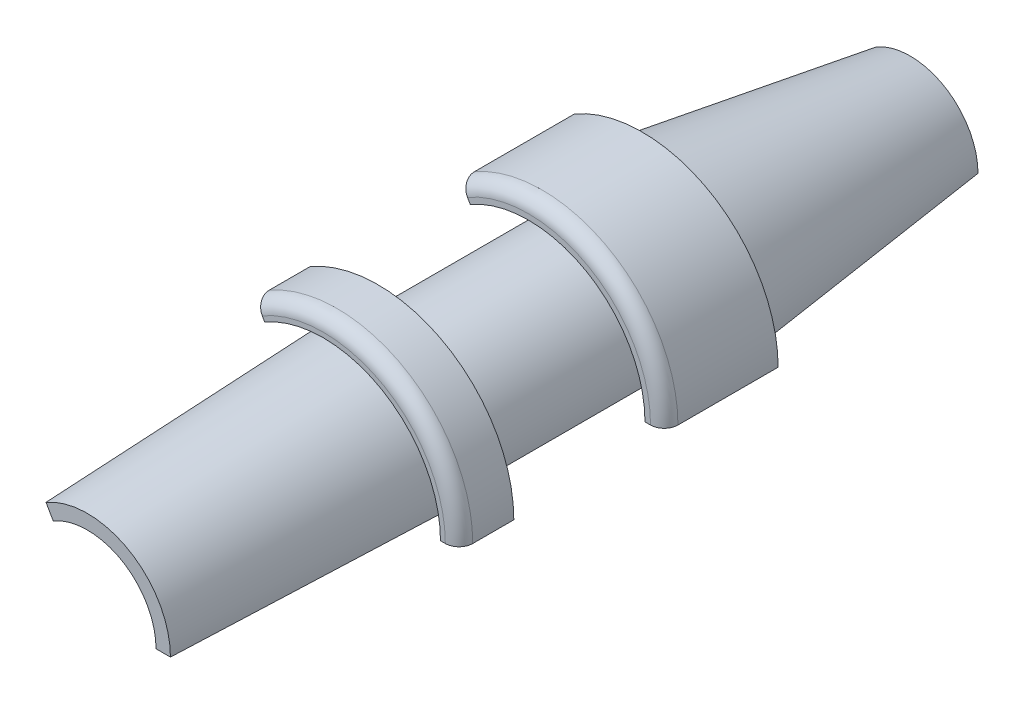
ISO-10303-21;
HEADER;
FILE_DESCRIPTION(('STEP AP214'),'2;1');
FILE_NAME('part.step','',(''),(''),'','','');
FILE_SCHEMA(('AUTOMOTIVE_DESIGN { 1 0 10303 214 1 1 1 1 }'));
ENDSEC;
DATA;
#1=APPLICATION_CONTEXT('core data for automotive mechanical design processes');
#2=APPLICATION_PROTOCOL_DEFINITION('international standard','automotive_design',2000,#1);
#3=PRODUCT_CONTEXT('',#1,'mechanical');
#4=PRODUCT('Part','Part','',(#3));
#5=PRODUCT_RELATED_PRODUCT_CATEGORY('part','',(#4));
#6=PRODUCT_DEFINITION_FORMATION('','',#4);
#7=PRODUCT_DEFINITION_CONTEXT('part definition',#1,'design');
#8=PRODUCT_DEFINITION('design','',#6,#7);
#9=PRODUCT_DEFINITION_SHAPE('','',#8);
#10=(LENGTH_UNIT() NAMED_UNIT(*) SI_UNIT(.MILLI.,.METRE.));
#11=(NAMED_UNIT(*) PLANE_ANGLE_UNIT() SI_UNIT($,.RADIAN.));
#12=(NAMED_UNIT(*) SI_UNIT($,.STERADIAN.) SOLID_ANGLE_UNIT());
#13=UNCERTAINTY_MEASURE_WITH_UNIT(LENGTH_MEASURE(1.E-05),#10,'distance_accuracy_value','');
#14=(GEOMETRIC_REPRESENTATION_CONTEXT(3) GLOBAL_UNCERTAINTY_ASSIGNED_CONTEXT((#13)) GLOBAL_UNIT_ASSIGNED_CONTEXT((#10,
#11,#12)) REPRESENTATION_CONTEXT('',''));
#15=CARTESIAN_POINT('',(0.,0.,0.));
#16=DIRECTION('',(0.,0.,1.));
#17=DIRECTION('',(1.,0.,0.));
#18=AXIS2_PLACEMENT_3D('',#15,#16,#17);
#19=CARTESIAN_POINT('',(0.,0.,0.));
#20=DIRECTION('',(0.,0.,-1.));
#21=DIRECTION('',(-1.,0.,0.));
#22=AXIS2_PLACEMENT_3D('',#19,#20,#21);
#23=CYLINDRICAL_SURFACE('',#22,2.025);
#24=CARTESIAN_POINT('',(0.,0.,28.5));
#25=DIRECTION('',(0.,0.,1.));
#26=DIRECTION('',(1.,0.,0.));
#27=AXIS2_PLACEMENT_3D('',#24,#25,#26);
#28=CIRCLE('',#27,2.025);
#29=CARTESIAN_POINT('',(-1.01250000000001,1.75370144266348,28.5));
#30=VERTEX_POINT('',#29);
#31=CARTESIAN_POINT('',(2.025,0.,28.5));
#32=VERTEX_POINT('',#31);
#33=EDGE_CURVE('E452',#30,#32,#28,.F.);
#34=ORIENTED_EDGE('',*,*,#33,.F.);
#35=DIRECTION('',(0.,0.,1.));
#36=VECTOR('',#35,1.);
#37=CARTESIAN_POINT('',(-1.01250000000001,1.75370144266348,0.));
#38=LINE('',#37,#36);
#39=CARTESIAN_POINT('',(-1.01250000000001,1.75370144266348,6.));
#40=VERTEX_POINT('',#39);
#41=EDGE_CURVE('E332',#40,#30,#38,.T.);
#42=ORIENTED_EDGE('',*,*,#41,.F.);
#43=CARTESIAN_POINT('',(0.,0.,6.));
#44=DIRECTION('',(0.,0.,-1.));
#45=DIRECTION('',(-1.,0.,0.));
#46=AXIS2_PLACEMENT_3D('',#43,#44,#45);
#47=CIRCLE('',#46,2.025);
#48=CARTESIAN_POINT('',(2.025,0.,6.));
#49=VERTEX_POINT('',#48);
#50=EDGE_CURVE('E335',#40,#49,#47,.T.);
#51=ORIENTED_EDGE('',*,*,#50,.T.);
#52=DIRECTION('',(0.,0.,1.));
#53=VECTOR('',#52,1.);
#54=CARTESIAN_POINT('',(2.025,0.,0.));
#55=LINE('',#54,#53);
#56=EDGE_CURVE('E277',#49,#32,#55,.T.);
#57=ORIENTED_EDGE('',*,*,#56,.T.);
#58=EDGE_LOOP('',(#34,#42,#51,#57));
#59=FACE_BOUND('',#58,.T.);
#60=ADVANCED_FACE('F35',(#59),#23,.F.);
#61=CARTESIAN_POINT('',(0.,0.,30.));
#62=DIRECTION('',(0.,0.,1.));
#63=DIRECTION('',(1.,0.,0.));
#64=AXIS2_PLACEMENT_3D('',#61,#62,#63);
#65=PLANE('',#64);
#66=CARTESIAN_POINT('',(0.,0.,30.));
#67=DIRECTION('',(0.,0.,1.));
#68=DIRECTION('',(1.,0.,0.));
#69=AXIS2_PLACEMENT_3D('',#66,#67,#68);
#70=CIRCLE('',#69,2.5);
#71=CARTESIAN_POINT('',(2.5,0.,30.));
#72=VERTEX_POINT('',#71);
#73=CARTESIAN_POINT('',(-1.25000000000001,2.16506350946109,30.));
#74=VERTEX_POINT('',#73);
#75=EDGE_CURVE('E199',#72,#74,#70,.T.);
#76=ORIENTED_EDGE('',*,*,#75,.F.);
#77=DIRECTION('',(-1.,0.,0.));
#78=VECTOR('',#77,1.);
#79=CARTESIAN_POINT('',(0.,0.,30.));
#80=LINE('',#79,#78);
#81=CARTESIAN_POINT('',(3.025,0.,30.));
#82=VERTEX_POINT('',#81);
#83=EDGE_CURVE('E213',#82,#72,#80,.T.);
#84=ORIENTED_EDGE('',*,*,#83,.F.);
#85=CARTESIAN_POINT('',(0.,0.,30.));
#86=DIRECTION('',(0.,0.,-1.));
#87=DIRECTION('',(-1.,0.,0.));
#88=AXIS2_PLACEMENT_3D('',#85,#86,#87);
#89=CIRCLE('',#88,3.025);
#90=CARTESIAN_POINT('',(-1.51250000000001,2.61972684644792,30.));
#91=VERTEX_POINT('',#90);
#92=EDGE_CURVE('E369',#91,#82,#89,.T.);
#93=ORIENTED_EDGE('',*,*,#92,.F.);
#94=DIRECTION('',(0.500000000000004,-0.866025403784436,0.));
#95=VECTOR('',#94,1.);
#96=CARTESIAN_POINT('',(0.,0.,30.));
#97=LINE('',#96,#95);
#98=EDGE_CURVE('E216',#91,#74,#97,.T.);
#99=ORIENTED_EDGE('',*,*,#98,.T.);
#100=EDGE_LOOP('',(#76,#84,#93,#99));
#101=FACE_BOUND('',#100,.T.);
#102=ADVANCED_FACE('F212',(#101),#65,.T.);
#103=CARTESIAN_POINT('',(0.,0.,20.));
#104=DIRECTION('',(0.,0.,-1.));
#105=DIRECTION('',(-1.,0.,0.));
#106=AXIS2_PLACEMENT_3D('',#103,#104,#105);
#107=CONICAL_SURFACE('',#106,3.44646791542901,0.0421218622610786);
#108=CARTESIAN_POINT('',(0.,0.,20.));
#109=DIRECTION('',(0.,0.,-1.));
#110=DIRECTION('',(-1.,0.,0.));
#111=AXIS2_PLACEMENT_3D('',#108,#109,#110);
#112=CIRCLE('',#111,3.44646791542901);
#113=CARTESIAN_POINT('',(-1.72323395771452,2.98472876808951,20.));
#114=VERTEX_POINT('',#113);
#115=CARTESIAN_POINT('',(3.44646791542901,0.,20.));
#116=VERTEX_POINT('',#115);
#117=EDGE_CURVE('E367',#114,#116,#112,.T.);
#118=ORIENTED_EDGE('',*,*,#117,.F.);
#119=DIRECTION('',(0.0210547037856716,-0.0364678166950954,0.999113005517389));
#120=VECTOR('',#119,1.);
#121=CARTESIAN_POINT('',(-2.14089888305084,3.70814563931148,0.180464037876745));
#122=LINE('',#121,#120);
#123=EDGE_CURVE('E281',#114,#91,#122,.T.);
#124=ORIENTED_EDGE('',*,*,#123,.T.);
#125=ORIENTED_EDGE('',*,*,#92,.T.);
#126=DIRECTION('',(-0.0421094075713426,0.,0.999113005517389));
#127=VECTOR('',#126,1.);
#128=CARTESIAN_POINT('',(4.28179776610165,0.,0.180464037876745));
#129=LINE('',#128,#127);
#130=EDGE_CURVE('E222',#116,#82,#129,.T.);
#131=ORIENTED_EDGE('',*,*,#130,.F.);
#132=EDGE_LOOP('',(#118,#124,#125,#131));
#133=FACE_BOUND('',#132,.T.);
#134=ADVANCED_FACE('F460',(#133),#107,.T.);
#135=CARTESIAN_POINT('',(0.,0.,20.253069256419));
#136=DIRECTION('',(0.,0.,1.));
#137=DIRECTION('',(1.,0.,0.));
#138=AXIS2_PLACEMENT_3D('',#135,#136,#137);
#139=CONICAL_SURFACE('',#138,4.09578672154361,1.19916094074387);
#140=CARTESIAN_POINT('',(0.,0.,20.253069256419));
#141=DIRECTION('',(0.,0.,-1.));
#142=DIRECTION('',(-1.,0.,0.));
#143=AXIS2_PLACEMENT_3D('',#140,#141,#142);
#144=CIRCLE('',#143,4.09578672154361);
#145=CARTESIAN_POINT('',(-2.04789336077182,3.54705534933974,20.253069256419));
#146=VERTEX_POINT('',#145);
#147=CARTESIAN_POINT('',(4.09578672154361,0.,20.253069256419));
#148=VERTEX_POINT('',#147);
#149=EDGE_CURVE('E365',#146,#148,#144,.T.);
#150=ORIENTED_EDGE('',*,*,#149,.F.);
#151=DIRECTION('',(0.465867359143861,-0.806905935625096,-0.363139662853443));
#152=VECTOR('',#151,1.);
#153=CARTESIAN_POINT('',(3.15625473798528,-5.46679356782044,16.196479866909));
#154=LINE('',#153,#152);
#155=EDGE_CURVE('E284',#146,#114,#154,.T.);
#156=ORIENTED_EDGE('',*,*,#155,.T.);
#157=ORIENTED_EDGE('',*,*,#117,.T.);
#158=DIRECTION('',(-0.931734718287715,0.,-0.363139662853443));
#159=VECTOR('',#158,1.);
#160=CARTESIAN_POINT('',(-6.31250947597051,0.,16.196479866909));
#161=LINE('',#160,#159);
#162=EDGE_CURVE('E225',#148,#116,#161,.T.);
#163=ORIENTED_EDGE('',*,*,#162,.F.);
#164=EDGE_LOOP('',(#150,#156,#157,#163));
#165=FACE_BOUND('',#164,.T.);
#166=ADVANCED_FACE('F463',(#165),#139,.F.);
#167=CARTESIAN_POINT('',(0.,0.,21.4015706340566));
#168=DIRECTION('',(0.,0.,1.));
#169=DIRECTION('',(1.,0.,0.));
#170=AXIS2_PLACEMENT_3D('',#167,#168,#169);
#171=CONICAL_SURFACE('',#170,4.27301567422525,0.153105569163119);
#172=CARTESIAN_POINT('',(0.,0.,21.4015706340566));
#173=DIRECTION('',(0.,0.,-1.));
#174=DIRECTION('',(-1.,0.,0.));
#175=AXIS2_PLACEMENT_3D('',#172,#173,#174);
#176=CIRCLE('',#175,4.27301567422525);
#177=CARTESIAN_POINT('',(-2.13650783711264,3.70054012464815,21.4015706340566));
#178=VERTEX_POINT('',#177);
#179=CARTESIAN_POINT('',(4.27301567422526,0.,21.4015706340566));
#180=VERTEX_POINT('',#179);
#181=EDGE_CURVE('E362',#178,#180,#176,.T.);
#182=ORIENTED_EDGE('',*,*,#181,.F.);
#183=DIRECTION('',(0.0762540519373897,-0.132075892238554,-0.988302220098953));
#184=VECTOR('',#183,1.);
#185=CARTESIAN_POINT('',(-0.473949184842444,0.820904068352957,-0.146273255373402));
#186=LINE('',#185,#184);
#187=EDGE_CURVE('E287',#178,#146,#186,.T.);
#188=ORIENTED_EDGE('',*,*,#187,.T.);
#189=ORIENTED_EDGE('',*,*,#149,.T.);
#190=DIRECTION('',(-0.152508103874778,0.,-0.988302220098953));
#191=VECTOR('',#190,1.);
#192=CARTESIAN_POINT('',(0.94789836968488,0.,-0.146273255373402));
#193=LINE('',#192,#191);
#194=EDGE_CURVE('E232',#180,#148,#193,.T.);
#195=ORIENTED_EDGE('',*,*,#194,.F.);
#196=EDGE_LOOP('',(#182,#188,#189,#195));
#197=FACE_BOUND('',#196,.T.);
#198=ADVANCED_FACE('F467',(#197),#171,.F.);
#199=CARTESIAN_POINT('',(0.,0.,21.4015706340566));
#200=DIRECTION('',(0.,0.,1.));
#201=DIRECTION('',(1.,0.,0.));
#202=AXIS2_PLACEMENT_3D('',#199,#200,#201);
#203=PLANE('',#202);
#204=DIRECTION('',(-1.,0.,0.));
#205=VECTOR('',#204,1.);
#206=CARTESIAN_POINT('',(-1.09679960342321E-13,0.,21.4015706340566));
#207=LINE('',#206,#205);
#208=CARTESIAN_POINT('',(4.45,0.,21.4015706340566));
#209=VERTEX_POINT('',#208);
#210=EDGE_CURVE('E235',#209,#180,#207,.T.);
#211=ORIENTED_EDGE('',*,*,#210,.F.);
#212=CARTESIAN_POINT('',(0.,0.,21.4015706340566));
#213=DIRECTION('',(0.,0.,1.));
#214=DIRECTION('',(1.,0.,0.));
#215=AXIS2_PLACEMENT_3D('',#212,#213,#214);
#216=CIRCLE('',#215,4.45);
#217=CARTESIAN_POINT('',(-2.22500000000001,3.85381304684074,21.4015706340566));
#218=VERTEX_POINT('',#217);
#219=EDGE_CURVE('E11',#209,#218,#216,.T.);
#220=ORIENTED_EDGE('',*,*,#219,.T.);
#221=DIRECTION('',(0.500000000000004,-0.866025403784436,0.));
#222=VECTOR('',#221,1.);
#223=CARTESIAN_POINT('',(0.,0.,21.4015706340566));
#224=LINE('',#223,#222);
#225=EDGE_CURVE('E290',#218,#178,#224,.T.);
#226=ORIENTED_EDGE('',*,*,#225,.T.);
#227=ORIENTED_EDGE('',*,*,#181,.T.);
#228=EDGE_LOOP('',(#211,#220,#226,#227));
#229=FACE_BOUND('',#228,.T.);
#230=ADVANCED_FACE('F469',(#229),#203,.T.);
#231=CARTESIAN_POINT('',(0.,0.,0.));
#232=DIRECTION('',(0.,0.,-1.));
#233=DIRECTION('',(-1.,0.,0.));
#234=AXIS2_PLACEMENT_3D('',#231,#232,#233);
#235=CYLINDRICAL_SURFACE('',#234,4.95);
#236=DIRECTION('',(0.,0.,1.));
#237=VECTOR('',#236,1.);
#238=CARTESIAN_POINT('',(-2.47500000000001,4.28682574873294,0.));
#239=LINE('',#238,#237);
#240=CARTESIAN_POINT('',(-2.47500000000002,4.28682574873296,19.4040706042719));
#241=VERTEX_POINT('',#240);
#242=CARTESIAN_POINT('',(-2.47500000000002,4.28682574873296,20.9015706340566));
#243=VERTEX_POINT('',#242);
#244=EDGE_CURVE('E292',#241,#243,#239,.T.);
#245=ORIENTED_EDGE('',*,*,#244,.T.);
#246=CARTESIAN_POINT('',(0.,0.,20.9015706340566));
#247=DIRECTION('',(0.,0.,1.));
#248=DIRECTION('',(1.,0.,0.));
#249=AXIS2_PLACEMENT_3D('',#246,#247,#248);
#250=CIRCLE('',#249,4.95);
#251=CARTESIAN_POINT('',(4.95,0.,20.9015706340566));
#252=VERTEX_POINT('',#251);
#253=EDGE_CURVE('E43',#243,#252,#250,.F.);
#254=ORIENTED_EDGE('',*,*,#253,.T.);
#255=DIRECTION('',(0.,0.,1.));
#256=VECTOR('',#255,1.);
#257=CARTESIAN_POINT('',(4.94999999999998,0.,0.));
#258=LINE('',#257,#256);
#259=CARTESIAN_POINT('',(4.95,0.,19.4040706042719));
#260=VERTEX_POINT('',#259);
#261=EDGE_CURVE('E237',#260,#252,#258,.T.);
#262=ORIENTED_EDGE('',*,*,#261,.F.);
#263=CARTESIAN_POINT('',(0.,0.,19.4040706042719));
#264=DIRECTION('',(0.,0.,-1.));
#265=DIRECTION('',(-1.,0.,0.));
#266=AXIS2_PLACEMENT_3D('',#263,#264,#265);
#267=CIRCLE('',#266,4.95);
#268=EDGE_CURVE('E360',#241,#260,#267,.T.);
#269=ORIENTED_EDGE('',*,*,#268,.F.);
#270=EDGE_LOOP('',(#245,#254,#262,#269));
#271=FACE_BOUND('',#270,.T.);
#272=ADVANCED_FACE('F386',(#271),#235,.T.);
#273=CARTESIAN_POINT('',(0.,0.,18.6018407873773));
#274=DIRECTION('',(0.,0.,1.));
#275=DIRECTION('',(1.,0.,0.));
#276=AXIS2_PLACEMENT_3D('',#273,#274,#275);
#277=CONICAL_SURFACE('',#276,3.11417222174756,1.1588179478444);
#278=CARTESIAN_POINT('',(0.,0.,18.6018407873773));
#279=DIRECTION('',(0.,0.,-1.));
#280=DIRECTION('',(-1.,0.,0.));
#281=AXIS2_PLACEMENT_3D('',#278,#279,#280);
#282=CIRCLE('',#281,3.11417222174756);
#283=CARTESIAN_POINT('',(-1.55708611087379,2.6969522557932,18.6018407873773));
#284=VERTEX_POINT('',#283);
#285=CARTESIAN_POINT('',(3.11417222174756,0.,18.6018407873773));
#286=VERTEX_POINT('',#285);
#287=EDGE_CURVE('E358',#284,#286,#282,.T.);
#288=ORIENTED_EDGE('',*,*,#287,.F.);
#289=DIRECTION('',(-0.458165214114944,0.793565429107749,0.400422959256886));
#290=VECTOR('',#289,1.);
#291=CARTESIAN_POINT('',(3.16303038521219,-5.47852933307161,14.4765974097213));
#292=LINE('',#291,#290);
#293=EDGE_CURVE('E294',#284,#241,#292,.T.);
#294=ORIENTED_EDGE('',*,*,#293,.T.);
#295=ORIENTED_EDGE('',*,*,#268,.T.);
#296=DIRECTION('',(0.916330428229882,0.,0.400422959256886));
#297=VECTOR('',#296,1.);
#298=CARTESIAN_POINT('',(-6.32606077042433,0.,14.4765974097213));
#299=LINE('',#298,#297);
#300=EDGE_CURVE('E240',#286,#260,#299,.T.);
#301=ORIENTED_EDGE('',*,*,#300,.F.);
#302=EDGE_LOOP('',(#288,#294,#295,#301));
#303=FACE_BOUND('',#302,.T.);
#304=ADVANCED_FACE('F391',(#303),#277,.T.);
#305=CARTESIAN_POINT('',(0.,0.,0.));
#306=DIRECTION('',(0.,0.,-1.));
#307=DIRECTION('',(-1.,0.,0.));
#308=AXIS2_PLACEMENT_3D('',#305,#306,#307);
#309=CYLINDRICAL_SURFACE('',#308,3.11417222174756);
#310=CARTESIAN_POINT('',(0.,0.,11.4905954073408));
#311=DIRECTION('',(0.,0.,-1.));
#312=DIRECTION('',(-1.,0.,0.));
#313=AXIS2_PLACEMENT_3D('',#310,#311,#312);
#314=CIRCLE('',#313,3.11417222174756);
#315=CARTESIAN_POINT('',(-1.55708611087379,2.6969522557932,11.4905954073408));
#316=VERTEX_POINT('',#315);
#317=CARTESIAN_POINT('',(3.11417222174756,0.,11.4905954073408));
#318=VERTEX_POINT('',#317);
#319=EDGE_CURVE('E356',#316,#318,#314,.T.);
#320=ORIENTED_EDGE('',*,*,#319,.F.);
#321=DIRECTION('',(0.,0.,1.));
#322=VECTOR('',#321,1.);
#323=CARTESIAN_POINT('',(-1.55708611087379,2.69695225579321,0.));
#324=LINE('',#323,#322);
#325=EDGE_CURVE('E297',#316,#284,#324,.T.);
#326=ORIENTED_EDGE('',*,*,#325,.T.);
#327=ORIENTED_EDGE('',*,*,#287,.T.);
#328=DIRECTION('',(0.,0.,1.));
#329=VECTOR('',#328,1.);
#330=CARTESIAN_POINT('',(3.11417222174756,0.,0.));
#331=LINE('',#330,#329);
#332=EDGE_CURVE('E243',#318,#286,#331,.T.);
#333=ORIENTED_EDGE('',*,*,#332,.F.);
#334=EDGE_LOOP('',(#320,#326,#327,#333));
#335=FACE_BOUND('',#334,.T.);
#336=ADVANCED_FACE('F398',(#335),#309,.T.);
#337=CARTESIAN_POINT('',(0.,0.,11.4905954073408));
#338=DIRECTION('',(0.,0.,1.));
#339=DIRECTION('',(1.,0.,0.));
#340=AXIS2_PLACEMENT_3D('',#337,#338,#339);
#341=PLANE('',#340);
#342=CARTESIAN_POINT('',(0.,0.,11.4905954073408));
#343=DIRECTION('',(0.,0.,-1.));
#344=DIRECTION('',(-1.,0.,0.));
#345=AXIS2_PLACEMENT_3D('',#342,#343,#344);
#346=CIRCLE('',#345,3.89619752177093);
#347=CARTESIAN_POINT('',(-1.94809876088548,3.37420603201559,11.4905954073408));
#348=VERTEX_POINT('',#347);
#349=CARTESIAN_POINT('',(3.89619752177093,0.,11.4905954073408));
#350=VERTEX_POINT('',#349);
#351=EDGE_CURVE('E354',#348,#350,#346,.T.);
#352=ORIENTED_EDGE('',*,*,#351,.F.);
#353=DIRECTION('',(0.500000000000004,-0.866025403784436,0.));
#354=VECTOR('',#353,1.);
#355=CARTESIAN_POINT('',(0.,0.,11.4905954073408));
#356=LINE('',#355,#354);
#357=EDGE_CURVE('E300',#348,#316,#356,.T.);
#358=ORIENTED_EDGE('',*,*,#357,.T.);
#359=ORIENTED_EDGE('',*,*,#319,.T.);
#360=DIRECTION('',(-1.,0.,0.));
#361=VECTOR('',#360,1.);
#362=CARTESIAN_POINT('',(0.,0.,11.4905954073408));
#363=LINE('',#362,#361);
#364=EDGE_CURVE('E246',#350,#318,#363,.T.);
#365=ORIENTED_EDGE('',*,*,#364,.F.);
#366=EDGE_LOOP('',(#352,#358,#359,#365));
#367=FACE_BOUND('',#366,.T.);
#368=ADVANCED_FACE('F401',(#367),#341,.T.);
#369=CARTESIAN_POINT('',(0.,0.,13.919413000995));
#370=DIRECTION('',(0.,0.,1.));
#371=DIRECTION('',(1.,0.,0.));
#372=AXIS2_PLACEMENT_3D('',#369,#370,#371);
#373=CONICAL_SURFACE('',#372,4.24767879273111,0.143715235703418);
#374=CARTESIAN_POINT('',(0.,0.,13.919413000995));
#375=DIRECTION('',(0.,0.,-1.));
#376=DIRECTION('',(-1.,0.,0.));
#377=AXIS2_PLACEMENT_3D('',#374,#375,#376);
#378=CIRCLE('',#377,4.24767879273111);
#379=CARTESIAN_POINT('',(-2.12383939636557,3.67859774162155,13.919413000995));
#380=VERTEX_POINT('',#379);
#381=CARTESIAN_POINT('',(4.24767879273111,0.,13.919413000995));
#382=VERTEX_POINT('',#381);
#383=EDGE_CURVE('E351',#380,#382,#378,.T.);
#384=ORIENTED_EDGE('',*,*,#383,.F.);
#385=DIRECTION('',(0.0716105144750793,-0.124033049426983,-0.989690727887484));
#386=VECTOR('',#385,1.);
#387=CARTESIAN_POINT('',(-1.09377435600361,1.89447275661416,-0.316566548098329));
#388=LINE('',#387,#386);
#389=EDGE_CURVE('E303',#380,#348,#388,.T.);
#390=ORIENTED_EDGE('',*,*,#389,.T.);
#391=ORIENTED_EDGE('',*,*,#351,.T.);
#392=DIRECTION('',(-0.143221028950158,0.,-0.989690727887484));
#393=VECTOR('',#392,1.);
#394=CARTESIAN_POINT('',(2.1875487120072,0.,-0.31656654809833));
#395=LINE('',#394,#393);
#396=EDGE_CURVE('E249',#382,#350,#395,.T.);
#397=ORIENTED_EDGE('',*,*,#396,.F.);
#398=EDGE_LOOP('',(#384,#390,#391,#397));
#399=FACE_BOUND('',#398,.T.);
#400=ADVANCED_FACE('F405',(#399),#373,.F.);
#401=CARTESIAN_POINT('',(0.,0.,13.919413000995));
#402=DIRECTION('',(0.,0.,1.));
#403=DIRECTION('',(1.,0.,0.));
#404=AXIS2_PLACEMENT_3D('',#401,#402,#403);
#405=PLANE('',#404);
#406=DIRECTION('',(-1.,0.,0.));
#407=VECTOR('',#406,1.);
#408=CARTESIAN_POINT('',(0.,0.,13.919413000995));
#409=LINE('',#408,#407);
#410=CARTESIAN_POINT('',(4.45,0.,13.919413000995));
#411=VERTEX_POINT('',#410);
#412=EDGE_CURVE('E252',#411,#382,#409,.T.);
#413=ORIENTED_EDGE('',*,*,#412,.F.);
#414=CARTESIAN_POINT('',(0.,0.,13.919413000995));
#415=DIRECTION('',(0.,0.,1.));
#416=DIRECTION('',(1.,0.,0.));
#417=AXIS2_PLACEMENT_3D('',#414,#415,#416);
#418=CIRCLE('',#417,4.45);
#419=CARTESIAN_POINT('',(-2.22500000000002,3.85381304684074,13.919413000995));
#420=VERTEX_POINT('',#419);
#421=EDGE_CURVE('E378',#411,#420,#418,.T.);
#422=ORIENTED_EDGE('',*,*,#421,.T.);
#423=DIRECTION('',(0.500000000000004,-0.866025403784436,0.));
#424=VECTOR('',#423,1.);
#425=CARTESIAN_POINT('',(0.,0.,13.919413000995));
#426=LINE('',#425,#424);
#427=EDGE_CURVE('E306',#420,#380,#426,.T.);
#428=ORIENTED_EDGE('',*,*,#427,.T.);
#429=ORIENTED_EDGE('',*,*,#383,.T.);
#430=EDGE_LOOP('',(#413,#422,#428,#429));
#431=FACE_BOUND('',#430,.T.);
#432=ADVANCED_FACE('F409',(#431),#405,.T.);
#433=CARTESIAN_POINT('',(0.,0.,0.));
#434=DIRECTION('',(0.,0.,-1.));
#435=DIRECTION('',(-1.,0.,0.));
#436=AXIS2_PLACEMENT_3D('',#433,#434,#435);
#437=CYLINDRICAL_SURFACE('',#436,4.95);
#438=DIRECTION('',(0.,0.,1.));
#439=VECTOR('',#438,1.);
#440=CARTESIAN_POINT('',(-2.47500000000002,4.28682574873296,0.));
#441=LINE('',#440,#439);
#442=CARTESIAN_POINT('',(-2.47500000000002,4.28682574873296,9.76632183966519));
#443=VERTEX_POINT('',#442);
#444=CARTESIAN_POINT('',(-2.47500000000002,4.28682574873296,13.419413000995));
#445=VERTEX_POINT('',#444);
#446=EDGE_CURVE('E308',#443,#445,#441,.T.);
#447=ORIENTED_EDGE('',*,*,#446,.T.);
#448=CARTESIAN_POINT('',(0.,0.,13.419413000995));
#449=DIRECTION('',(0.,0.,1.));
#450=DIRECTION('',(1.,0.,0.));
#451=AXIS2_PLACEMENT_3D('',#448,#449,#450);
#452=CIRCLE('',#451,4.95);
#453=CARTESIAN_POINT('',(4.95,0.,13.419413000995));
#454=VERTEX_POINT('',#453);
#455=EDGE_CURVE('E206',#445,#454,#452,.F.);
#456=ORIENTED_EDGE('',*,*,#455,.T.);
#457=DIRECTION('',(0.,0.,1.));
#458=VECTOR('',#457,1.);
#459=CARTESIAN_POINT('',(4.95,0.,0.));
#460=LINE('',#459,#458);
#461=CARTESIAN_POINT('',(4.95,0.,9.76632183966518));
#462=VERTEX_POINT('',#461);
#463=EDGE_CURVE('E254',#462,#454,#460,.T.);
#464=ORIENTED_EDGE('',*,*,#463,.F.);
#465=CARTESIAN_POINT('',(0.,0.,9.76632183966519));
#466=DIRECTION('',(0.,0.,-1.));
#467=DIRECTION('',(-1.,0.,0.));
#468=AXIS2_PLACEMENT_3D('',#465,#466,#467);
#469=CIRCLE('',#468,4.95);
#470=EDGE_CURVE('E349',#443,#462,#469,.T.);
#471=ORIENTED_EDGE('',*,*,#470,.F.);
#472=EDGE_LOOP('',(#447,#456,#464,#471));
#473=FACE_BOUND('',#472,.T.);
#474=ADVANCED_FACE('F418',(#473),#437,.T.);
#475=CARTESIAN_POINT('',(0.,0.,9.28494801195346));
#476=DIRECTION('',(0.,0.,1.));
#477=DIRECTION('',(1.,0.,0.));
#478=AXIS2_PLACEMENT_3D('',#475,#476,#477);
#479=CONICAL_SURFACE('',#478,3.89619752177093,1.14230439695923);
#480=CARTESIAN_POINT('',(0.,0.,9.28494801195346));
#481=DIRECTION('',(0.,0.,-1.));
#482=DIRECTION('',(-1.,0.,0.));
#483=AXIS2_PLACEMENT_3D('',#480,#481,#482);
#484=CIRCLE('',#483,3.89619752177093);
#485=CARTESIAN_POINT('',(-1.94809876088548,3.37420603201559,9.28494801195346));
#486=VERTEX_POINT('',#485);
#487=CARTESIAN_POINT('',(3.89619752177093,0.,9.28494801195346));
#488=VERTEX_POINT('',#487);
#489=EDGE_CURVE('E347',#486,#488,#484,.T.);
#490=ORIENTED_EDGE('',*,*,#489,.F.);
#491=DIRECTION('',(-0.454796693118498,0.78773097959554,0.415499544781856));
#492=VECTOR('',#491,1.);
#493=CARTESIAN_POINT('',(1.41823685480149,-2.45645828968283,6.20948388245406));
#494=LINE('',#493,#492);
#495=EDGE_CURVE('E311',#486,#443,#494,.T.);
#496=ORIENTED_EDGE('',*,*,#495,.T.);
#497=ORIENTED_EDGE('',*,*,#470,.T.);
#498=DIRECTION('',(0.909593386236988,0.,0.415499544781856));
#499=VECTOR('',#498,1.);
#500=CARTESIAN_POINT('',(-2.83647370960295,0.,6.20948388245406));
#501=LINE('',#500,#499);
#502=EDGE_CURVE('E256',#488,#462,#501,.T.);
#503=ORIENTED_EDGE('',*,*,#502,.F.);
#504=EDGE_LOOP('',(#490,#496,#497,#503));
#505=FACE_BOUND('',#504,.T.);
#506=ADVANCED_FACE('F422',(#505),#479,.T.);
#507=CARTESIAN_POINT('',(0.,0.,0.));
#508=DIRECTION('',(0.,0.,1.));
#509=DIRECTION('',(1.,0.,0.));
#510=AXIS2_PLACEMENT_3D('',#507,#508,#509);
#511=CONICAL_SURFACE('',#510,2.47115432273491,0.152290503207744);
#512=CARTESIAN_POINT('',(0.,0.,0.));
#513=DIRECTION('',(0.,0.,-1.));
#514=DIRECTION('',(-1.,0.,0.));
#515=AXIS2_PLACEMENT_3D('',#512,#513,#514);
#516=CIRCLE('',#515,2.47115432273491);
#517=CARTESIAN_POINT('',(-1.23557716136747,2.14008242016016,0.));
#518=VERTEX_POINT('',#517);
#519=CARTESIAN_POINT('',(2.47115432273491,0.,0.));
#520=VERTEX_POINT('',#519);
#521=EDGE_CURVE('E345',#518,#520,#516,.T.);
#522=ORIENTED_EDGE('',*,*,#521,.F.);
#523=DIRECTION('',(-0.075851260906351,0.131378237707962,0.988426195967947));
#524=VECTOR('',#523,1.);
#525=CARTESIAN_POINT('',(-1.20714201469625,2.09083130140494,-0.370541550927133));
#526=LINE('',#525,#524);
#527=EDGE_CURVE('E314',#518,#486,#526,.T.);
#528=ORIENTED_EDGE('',*,*,#527,.T.);
#529=ORIENTED_EDGE('',*,*,#489,.T.);
#530=DIRECTION('',(0.151702521812701,0.,0.988426195967947));
#531=VECTOR('',#530,1.);
#532=CARTESIAN_POINT('',(2.41428402939249,0.,-0.370541550927133));
#533=LINE('',#532,#531);
#534=EDGE_CURVE('E259',#520,#488,#533,.T.);
#535=ORIENTED_EDGE('',*,*,#534,.F.);
#536=EDGE_LOOP('',(#522,#528,#529,#535));
#537=FACE_BOUND('',#536,.T.);
#538=ADVANCED_FACE('F427',(#537),#511,.T.);
#539=CARTESIAN_POINT('',(0.,0.,0.));
#540=DIRECTION('',(0.,0.,-1.));
#541=DIRECTION('',(-1.,0.,0.));
#542=AXIS2_PLACEMENT_3D('',#539,#540,#541);
#543=PLANE('',#542);
#544=CARTESIAN_POINT('',(0.,0.,0.));
#545=DIRECTION('',(0.,0.,-1.));
#546=DIRECTION('',(-1.,0.,0.));
#547=AXIS2_PLACEMENT_3D('',#544,#545,#546);
#548=CIRCLE('',#547,2.025);
#549=CARTESIAN_POINT('',(-1.01250000000001,1.75370144266348,0.));
#550=VERTEX_POINT('',#549);
#551=CARTESIAN_POINT('',(2.025,0.,0.));
#552=VERTEX_POINT('',#551);
#553=EDGE_CURVE('E343',#550,#552,#548,.T.);
#554=ORIENTED_EDGE('',*,*,#553,.F.);
#555=DIRECTION('',(-0.500000000000004,0.866025403784436,0.));
#556=VECTOR('',#555,1.);
#557=CARTESIAN_POINT('',(0.,0.,0.));
#558=LINE('',#557,#556);
#559=EDGE_CURVE('E317',#550,#518,#558,.T.);
#560=ORIENTED_EDGE('',*,*,#559,.T.);
#561=ORIENTED_EDGE('',*,*,#521,.T.);
#562=DIRECTION('',(1.,0.,0.));
#563=VECTOR('',#562,1.);
#564=CARTESIAN_POINT('',(0.,0.,0.));
#565=LINE('',#564,#563);
#566=EDGE_CURVE('E262',#552,#520,#565,.T.);
#567=ORIENTED_EDGE('',*,*,#566,.F.);
#568=EDGE_LOOP('',(#554,#560,#561,#567));
#569=FACE_BOUND('',#568,.T.);
#570=ADVANCED_FACE('F430',(#569),#543,.T.);
#571=CARTESIAN_POINT('',(0.,0.,0.));
#572=DIRECTION('',(0.,0.,-1.));
#573=DIRECTION('',(-1.,0.,0.));
#574=AXIS2_PLACEMENT_3D('',#571,#572,#573);
#575=CYLINDRICAL_SURFACE('',#574,2.025);
#576=CARTESIAN_POINT('',(0.,0.,5.));
#577=DIRECTION('',(0.,0.,-1.));
#578=DIRECTION('',(-1.,0.,0.));
#579=AXIS2_PLACEMENT_3D('',#576,#577,#578);
#580=CIRCLE('',#579,2.025);
#581=CARTESIAN_POINT('',(-1.01250000000001,1.75370144266348,5.));
#582=VERTEX_POINT('',#581);
#583=CARTESIAN_POINT('',(2.025,0.,5.));
#584=VERTEX_POINT('',#583);
#585=EDGE_CURVE('E341',#582,#584,#580,.T.);
#586=ORIENTED_EDGE('',*,*,#585,.F.);
#587=DIRECTION('',(0.,0.,1.));
#588=VECTOR('',#587,1.);
#589=CARTESIAN_POINT('',(-1.01250000000001,1.75370144266348,0.));
#590=LINE('',#589,#588);
#591=EDGE_CURVE('E320',#550,#582,#590,.T.);
#592=ORIENTED_EDGE('',*,*,#591,.F.);
#593=ORIENTED_EDGE('',*,*,#553,.T.);
#594=DIRECTION('',(0.,0.,1.));
#595=VECTOR('',#594,1.);
#596=CARTESIAN_POINT('',(2.025,0.,0.));
#597=LINE('',#596,#595);
#598=EDGE_CURVE('E265',#552,#584,#597,.T.);
#599=ORIENTED_EDGE('',*,*,#598,.T.);
#600=EDGE_LOOP('',(#586,#592,#593,#599));
#601=FACE_BOUND('',#600,.T.);
#602=ADVANCED_FACE('F435',(#601),#575,.F.);
#603=CARTESIAN_POINT('',(0.,0.,5.));
#604=DIRECTION('',(0.,0.,-1.));
#605=DIRECTION('',(-1.,0.,0.));
#606=AXIS2_PLACEMENT_3D('',#603,#604,#605);
#607=CONICAL_SURFACE('',#606,2.025,0.785398163397461);
#608=CARTESIAN_POINT('',(0.,0.,5.05));
#609=DIRECTION('',(0.,0.,-1.));
#610=DIRECTION('',(-1.,0.,0.));
#611=AXIS2_PLACEMENT_3D('',#608,#609,#610);
#612=CIRCLE('',#611,1.975);
#613=CARTESIAN_POINT('',(-0.987500000000007,1.71040017247426,5.05));
#614=VERTEX_POINT('',#613);
#615=CARTESIAN_POINT('',(1.975,0.,5.05));
#616=VERTEX_POINT('',#615);
#617=EDGE_CURVE('E339',#614,#616,#612,.T.);
#618=ORIENTED_EDGE('',*,*,#617,.F.);
#619=DIRECTION('',(0.353553390593278,-0.612372435695796,0.707106781186544));
#620=VECTOR('',#619,1.);
#621=CARTESIAN_POINT('',(-1.75625000000001,3.04191423079282,3.51250000000002));
#622=LINE('',#621,#620);
#623=EDGE_CURVE('E323',#582,#614,#622,.T.);
#624=ORIENTED_EDGE('',*,*,#623,.F.);
#625=ORIENTED_EDGE('',*,*,#585,.T.);
#626=DIRECTION('',(-0.707106781186551,0.,0.707106781186544));
#627=VECTOR('',#626,1.);
#628=CARTESIAN_POINT('',(3.51249999999999,0.,3.51250000000002));
#629=LINE('',#628,#627);
#630=EDGE_CURVE('E268',#584,#616,#629,.T.);
#631=ORIENTED_EDGE('',*,*,#630,.T.);
#632=EDGE_LOOP('',(#618,#624,#625,#631));
#633=FACE_BOUND('',#632,.T.);
#634=ADVANCED_FACE('F438',(#633),#607,.F.);
#635=CARTESIAN_POINT('',(0.,0.,0.));
#636=DIRECTION('',(0.,0.,-1.));
#637=DIRECTION('',(-1.,0.,0.));
#638=AXIS2_PLACEMENT_3D('',#635,#636,#637);
#639=CYLINDRICAL_SURFACE('',#638,1.975);
#640=CARTESIAN_POINT('',(0.,0.,5.95));
#641=DIRECTION('',(0.,0.,-1.));
#642=DIRECTION('',(-1.,0.,0.));
#643=AXIS2_PLACEMENT_3D('',#640,#641,#642);
#644=CIRCLE('',#643,1.975);
#645=CARTESIAN_POINT('',(-0.987500000000007,1.71040017247426,5.95));
#646=VERTEX_POINT('',#645);
#647=CARTESIAN_POINT('',(1.975,0.,5.95));
#648=VERTEX_POINT('',#647);
#649=EDGE_CURVE('E337',#646,#648,#644,.T.);
#650=ORIENTED_EDGE('',*,*,#649,.F.);
#651=DIRECTION('',(0.,0.,1.));
#652=VECTOR('',#651,1.);
#653=CARTESIAN_POINT('',(-0.987500000000008,1.71040017247426,0.));
#654=LINE('',#653,#652);
#655=EDGE_CURVE('E326',#614,#646,#654,.T.);
#656=ORIENTED_EDGE('',*,*,#655,.F.);
#657=ORIENTED_EDGE('',*,*,#617,.T.);
#658=DIRECTION('',(0.,0.,1.));
#659=VECTOR('',#658,1.);
#660=CARTESIAN_POINT('',(1.975,0.,0.));
#661=LINE('',#660,#659);
#662=EDGE_CURVE('E271',#616,#648,#661,.T.);
#663=ORIENTED_EDGE('',*,*,#662,.T.);
#664=EDGE_LOOP('',(#650,#656,#657,#663));
#665=FACE_BOUND('',#664,.T.);
#666=ADVANCED_FACE('F443',(#665),#639,.F.);
#667=CARTESIAN_POINT('',(0.,0.,5.95));
#668=DIRECTION('',(0.,0.,1.));
#669=DIRECTION('',(1.,0.,0.));
#670=AXIS2_PLACEMENT_3D('',#667,#668,#669);
#671=CONICAL_SURFACE('',#670,1.975,0.785398163397448);
#672=ORIENTED_EDGE('',*,*,#50,.F.);
#673=DIRECTION('',(-0.353553390593277,0.612372435695793,0.707106781186548));
#674=VECTOR('',#673,1.);
#675=CARTESIAN_POINT('',(0.993750000000008,-1.72122549002157,1.9875));
#676=LINE('',#675,#674);
#677=EDGE_CURVE('E329',#646,#40,#676,.T.);
#678=ORIENTED_EDGE('',*,*,#677,.F.);
#679=ORIENTED_EDGE('',*,*,#649,.T.);
#680=DIRECTION('',(0.707106781186548,0.,0.707106781186548));
#681=VECTOR('',#680,1.);
#682=CARTESIAN_POINT('',(-1.9875,0.,1.9875));
#683=LINE('',#682,#681);
#684=EDGE_CURVE('E274',#648,#49,#683,.T.);
#685=ORIENTED_EDGE('',*,*,#684,.T.);
#686=EDGE_LOOP('',(#672,#678,#679,#685));
#687=FACE_BOUND('',#686,.T.);
#688=ADVANCED_FACE('F446',(#687),#671,.F.);
#689=CARTESIAN_POINT('',(0.,0.,0.));
#690=DIRECTION('',(-0.866025403784436,-0.500000000000004,0.));
#691=DIRECTION('',(0.,0.,1.));
#692=AXIS2_PLACEMENT_3D('',#689,#690,#691);
#693=PLANE('',#692);
#694=ORIENTED_EDGE('',*,*,#427,.F.);
#695=CARTESIAN_POINT('',(-2.22500000000002,3.85381304684074,13.419413000995));
#696=DIRECTION('',(-0.866025403784436,-0.500000000000004,0.));
#697=DIRECTION('',(0.500000000000004,-0.866025403784436,0.));
#698=AXIS2_PLACEMENT_3D('',#695,#696,#697);
#699=CIRCLE('',#698,0.5);
#700=EDGE_CURVE('E381',#420,#445,#699,.T.);
#701=ORIENTED_EDGE('',*,*,#700,.T.);
#702=ORIENTED_EDGE('',*,*,#446,.F.);
#703=ORIENTED_EDGE('',*,*,#495,.F.);
#704=ORIENTED_EDGE('',*,*,#527,.F.);
#705=ORIENTED_EDGE('',*,*,#559,.F.);
#706=ORIENTED_EDGE('',*,*,#591,.T.);
#707=ORIENTED_EDGE('',*,*,#623,.T.);
#708=ORIENTED_EDGE('',*,*,#655,.T.);
#709=ORIENTED_EDGE('',*,*,#677,.T.);
#710=ORIENTED_EDGE('',*,*,#41,.T.);
#711=DIRECTION('',(-0.500000000000004,0.866025403784436,0.));
#712=VECTOR('',#711,1.);
#713=CARTESIAN_POINT('',(0.,0.,28.5));
#714=LINE('',#713,#712);
#715=CARTESIAN_POINT('',(-1.25000000000001,2.16506350946109,28.5));
#716=VERTEX_POINT('',#715);
#717=EDGE_CURVE('E227',#30,#716,#714,.T.);
#718=ORIENTED_EDGE('',*,*,#717,.T.);
#719=DIRECTION('',(0.,0.,1.));
#720=VECTOR('',#719,1.);
#721=CARTESIAN_POINT('',(-1.25000000000001,2.16506350946109,28.5));
#722=LINE('',#721,#720);
#723=EDGE_CURVE('E223',#74,#716,#722,.F.);
#724=ORIENTED_EDGE('',*,*,#723,.F.);
#725=ORIENTED_EDGE('',*,*,#98,.F.);
#726=ORIENTED_EDGE('',*,*,#123,.F.);
#727=ORIENTED_EDGE('',*,*,#155,.F.);
#728=ORIENTED_EDGE('',*,*,#187,.F.);
#729=ORIENTED_EDGE('',*,*,#225,.F.);
#730=CARTESIAN_POINT('',(-2.22500000000002,3.85381304684074,20.9015706340566));
#731=DIRECTION('',(-0.866025403784436,-0.500000000000004,0.));
#732=DIRECTION('',(0.500000000000004,-0.866025403784436,0.));
#733=AXIS2_PLACEMENT_3D('',#730,#731,#732);
#734=CIRCLE('',#733,0.5);
#735=EDGE_CURVE('E50',#218,#243,#734,.T.);
#736=ORIENTED_EDGE('',*,*,#735,.T.);
#737=ORIENTED_EDGE('',*,*,#244,.F.);
#738=ORIENTED_EDGE('',*,*,#293,.F.);
#739=ORIENTED_EDGE('',*,*,#325,.F.);
#740=ORIENTED_EDGE('',*,*,#357,.F.);
#741=ORIENTED_EDGE('',*,*,#389,.F.);
#742=EDGE_LOOP('',(#694,#701,#702,#703,#704,#705,#706,#707,#708,#709,#710,#718,#724,#725,#726,
#727,#728,#729,#736,#737,#738,#739,#740,#741));
#743=FACE_BOUND('',#742,.T.);
#744=ADVANCED_FACE('F394',(#743),#693,.T.);
#745=CARTESIAN_POINT('',(0.,0.,0.));
#746=DIRECTION('',(0.,1.,0.));
#747=DIRECTION('',(0.,0.,1.));
#748=AXIS2_PLACEMENT_3D('',#745,#746,#747);
#749=PLANE('',#748);
#750=ORIENTED_EDGE('',*,*,#463,.T.);
#751=CARTESIAN_POINT('',(4.45,0.,13.419413000995));
#752=DIRECTION('',(0.,1.,0.));
#753=DIRECTION('',(0.,0.,1.));
#754=AXIS2_PLACEMENT_3D('',#751,#752,#753);
#755=CIRCLE('',#754,0.5);
#756=EDGE_CURVE('E376',#454,#411,#755,.F.);
#757=ORIENTED_EDGE('',*,*,#756,.T.);
#758=ORIENTED_EDGE('',*,*,#412,.T.);
#759=ORIENTED_EDGE('',*,*,#396,.T.);
#760=ORIENTED_EDGE('',*,*,#364,.T.);
#761=ORIENTED_EDGE('',*,*,#332,.T.);
#762=ORIENTED_EDGE('',*,*,#300,.T.);
#763=ORIENTED_EDGE('',*,*,#261,.T.);
#764=CARTESIAN_POINT('',(4.45,0.,20.9015706340566));
#765=DIRECTION('',(0.,1.,0.));
#766=DIRECTION('',(0.,0.,1.));
#767=AXIS2_PLACEMENT_3D('',#764,#765,#766);
#768=CIRCLE('',#767,0.5);
#769=EDGE_CURVE('E374',#252,#209,#768,.F.);
#770=ORIENTED_EDGE('',*,*,#769,.T.);
#771=ORIENTED_EDGE('',*,*,#210,.T.);
#772=ORIENTED_EDGE('',*,*,#194,.T.);
#773=ORIENTED_EDGE('',*,*,#162,.T.);
#774=ORIENTED_EDGE('',*,*,#130,.T.);
#775=ORIENTED_EDGE('',*,*,#83,.T.);
#776=DIRECTION('',(0.,0.,1.));
#777=VECTOR('',#776,1.);
#778=CARTESIAN_POINT('',(2.5,0.,28.5));
#779=LINE('',#778,#777);
#780=CARTESIAN_POINT('',(2.5,0.,28.5));
#781=VERTEX_POINT('',#780);
#782=EDGE_CURVE('E196',#72,#781,#779,.F.);
#783=ORIENTED_EDGE('',*,*,#782,.T.);
#784=DIRECTION('',(1.,0.,0.));
#785=VECTOR('',#784,1.);
#786=CARTESIAN_POINT('',(0.,0.,28.5));
#787=LINE('',#786,#785);
#788=EDGE_CURVE('E207',#32,#781,#787,.T.);
#789=ORIENTED_EDGE('',*,*,#788,.F.);
#790=ORIENTED_EDGE('',*,*,#56,.F.);
#791=ORIENTED_EDGE('',*,*,#684,.F.);
#792=ORIENTED_EDGE('',*,*,#662,.F.);
#793=ORIENTED_EDGE('',*,*,#630,.F.);
#794=ORIENTED_EDGE('',*,*,#598,.F.);
#795=ORIENTED_EDGE('',*,*,#566,.T.);
#796=ORIENTED_EDGE('',*,*,#534,.T.);
#797=ORIENTED_EDGE('',*,*,#502,.T.);
#798=EDGE_LOOP('',(#750,#757,#758,#759,#760,#761,#762,#763,#770,#771,#772,#773,#774,#775,#783,
#789,#790,#791,#792,#793,#794,#795,#796,#797));
#799=FACE_BOUND('',#798,.T.);
#800=ADVANCED_FACE('F219',(#799),#749,.F.);
#801=CARTESIAN_POINT('',(0.,0.,28.5));
#802=DIRECTION('',(0.,0.,1.));
#803=DIRECTION('',(1.,0.,0.));
#804=AXIS2_PLACEMENT_3D('',#801,#802,#803);
#805=CYLINDRICAL_SURFACE('',#804,2.5);
#806=ORIENTED_EDGE('',*,*,#723,.T.);
#807=CARTESIAN_POINT('',(0.,0.,28.5));
#808=DIRECTION('',(0.,0.,1.));
#809=DIRECTION('',(1.,0.,0.));
#810=AXIS2_PLACEMENT_3D('',#807,#808,#809);
#811=CIRCLE('',#810,2.5);
#812=EDGE_CURVE('E202',#781,#716,#811,.T.);
#813=ORIENTED_EDGE('',*,*,#812,.F.);
#814=ORIENTED_EDGE('',*,*,#782,.F.);
#815=ORIENTED_EDGE('',*,*,#75,.T.);
#816=EDGE_LOOP('',(#806,#813,#814,#815));
#817=FACE_BOUND('',#816,.T.);
#818=ADVANCED_FACE('F198',(#817),#805,.F.);
#819=CARTESIAN_POINT('',(0.,0.,28.5));
#820=DIRECTION('',(0.,0.,1.));
#821=DIRECTION('',(1.,0.,0.));
#822=AXIS2_PLACEMENT_3D('',#819,#820,#821);
#823=PLANE('',#822);
#824=ORIENTED_EDGE('',*,*,#33,.T.);
#825=ORIENTED_EDGE('',*,*,#788,.T.);
#826=ORIENTED_EDGE('',*,*,#812,.T.);
#827=ORIENTED_EDGE('',*,*,#717,.F.);
#828=EDGE_LOOP('',(#824,#825,#826,#827));
#829=FACE_BOUND('',#828,.T.);
#830=ADVANCED_FACE('F456',(#829),#823,.T.);
#831=CARTESIAN_POINT('',(0.,0.,13.419413000995));
#832=DIRECTION('',(0.,0.,1.));
#833=DIRECTION('',(1.,0.,0.));
#834=AXIS2_PLACEMENT_3D('',#831,#832,#833);
#835=TOROIDAL_SURFACE('',#834,4.45,0.5);
#836=ORIENTED_EDGE('',*,*,#700,.F.);
#837=ORIENTED_EDGE('',*,*,#421,.F.);
#838=ORIENTED_EDGE('',*,*,#756,.F.);
#839=ORIENTED_EDGE('',*,*,#455,.F.);
#840=EDGE_LOOP('',(#836,#837,#838,#839));
#841=FACE_BOUND('',#840,.T.);
#842=ADVANCED_FACE('F415',(#841),#835,.T.);
#843=CARTESIAN_POINT('',(0.,0.,20.9015706340566));
#844=DIRECTION('',(0.,0.,1.));
#845=DIRECTION('',(1.,0.,0.));
#846=AXIS2_PLACEMENT_3D('',#843,#844,#845);
#847=TOROIDAL_SURFACE('',#846,4.45,0.5);
#848=ORIENTED_EDGE('',*,*,#735,.F.);
#849=ORIENTED_EDGE('',*,*,#219,.F.);
#850=ORIENTED_EDGE('',*,*,#769,.F.);
#851=ORIENTED_EDGE('',*,*,#253,.F.);
#852=EDGE_LOOP('',(#848,#849,#850,#851));
#853=FACE_BOUND('',#852,.T.);
#854=ADVANCED_FACE('F37',(#853),#847,.T.);
#855=CLOSED_SHELL('',(#60,#102,#134,#166,#198,#230,#272,#304,#336,#368,#400,#432,#474,#506,#538,
#570,#602,#634,#666,#688,#744,#800,#818,#830,#842,#854));
#856=MANIFOLD_SOLID_BREP('B2',#855);
#857=ADVANCED_BREP_SHAPE_REPRESENTATION('',(#18,#856),#14);
#858=SHAPE_DEFINITION_REPRESENTATION(#9,#857);
ENDSEC;
END-ISO-10303-21;
